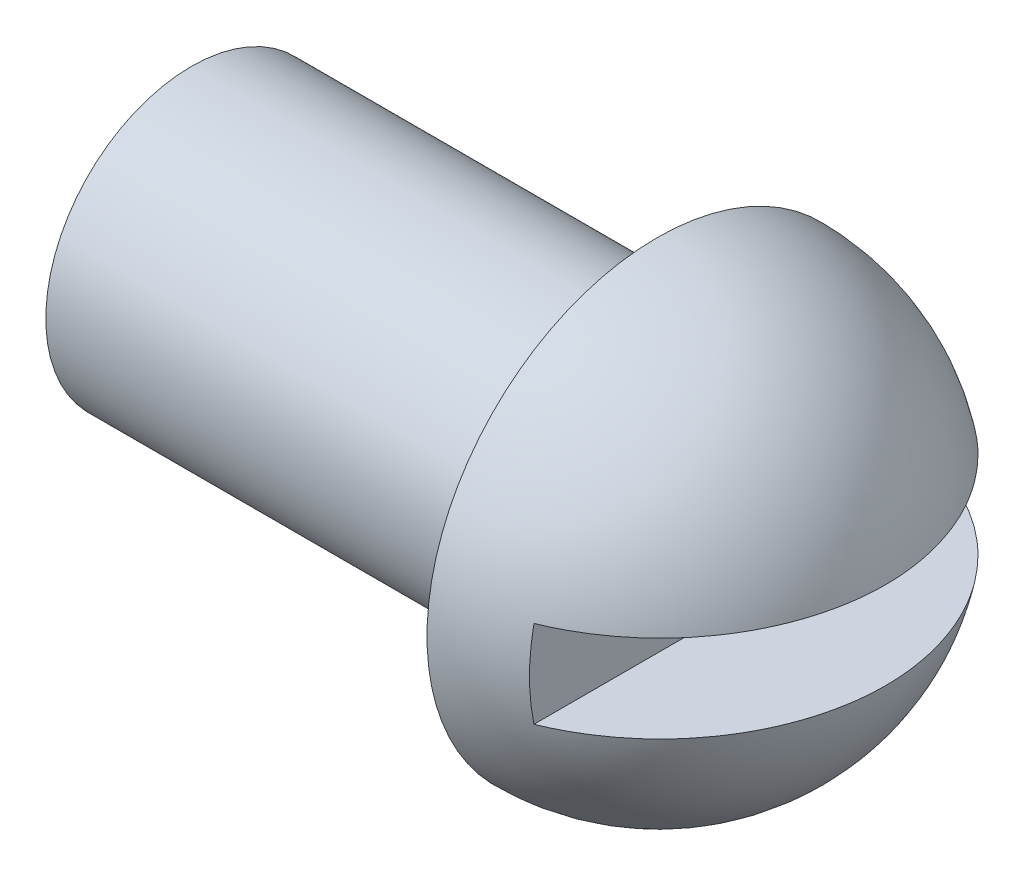
ISO-10303-21;
HEADER;
FILE_DESCRIPTION(('STEP AP214'),'2;1');
FILE_NAME('part.step','',(''),(''),'','','');
FILE_SCHEMA(('AUTOMOTIVE_DESIGN { 1 0 10303 214 1 1 1 1 }'));
ENDSEC;
DATA;
#1=APPLICATION_CONTEXT('core data for automotive mechanical design processes');
#2=APPLICATION_PROTOCOL_DEFINITION('international standard','automotive_design',2000,#1);
#3=PRODUCT_CONTEXT('',#1,'mechanical');
#4=PRODUCT('Part','Part','',(#3));
#5=PRODUCT_RELATED_PRODUCT_CATEGORY('part','',(#4));
#6=PRODUCT_DEFINITION_FORMATION('','',#4);
#7=PRODUCT_DEFINITION_CONTEXT('part definition',#1,'design');
#8=PRODUCT_DEFINITION('design','',#6,#7);
#9=PRODUCT_DEFINITION_SHAPE('','',#8);
#10=(LENGTH_UNIT() NAMED_UNIT(*) SI_UNIT(.MILLI.,.METRE.));
#11=(NAMED_UNIT(*) PLANE_ANGLE_UNIT() SI_UNIT($,.RADIAN.));
#12=(NAMED_UNIT(*) SI_UNIT($,.STERADIAN.) SOLID_ANGLE_UNIT());
#13=UNCERTAINTY_MEASURE_WITH_UNIT(LENGTH_MEASURE(1.E-05),#10,'distance_accuracy_value','');
#14=(GEOMETRIC_REPRESENTATION_CONTEXT(3) GLOBAL_UNCERTAINTY_ASSIGNED_CONTEXT((#13)) GLOBAL_UNIT_ASSIGNED_CONTEXT((#10,
#11,#12)) REPRESENTATION_CONTEXT('',''));
#15=CARTESIAN_POINT('',(0.,0.,0.));
#16=DIRECTION('',(0.,0.,1.));
#17=DIRECTION('',(1.,0.,0.));
#18=AXIS2_PLACEMENT_3D('',#15,#16,#17);
#19=CARTESIAN_POINT('',(8.00026825198543,0.,0.));
#20=DIRECTION('',(1.,0.,0.));
#21=DIRECTION('',(0.,1.,0.));
#22=AXIS2_PLACEMENT_3D('',#19,#20,#21);
#23=DEGENERATE_TOROIDAL_SURFACE('',#22,0.0463243340406743,4.,.F.);
#24=CARTESIAN_POINT('',(8.,0.,0.));
#25=DIRECTION('',(1.,0.,0.));
#26=DIRECTION('',(0.,1.,0.));
#27=AXIS2_PLACEMENT_3D('',#24,#25,#26);
#28=CIRCLE('',#27,3.95367565696443);
#29=CARTESIAN_POINT('',(8.,3.95367565696443,0.));
#30=VERTEX_POINT('',#29);
#31=EDGE_CURVE('E74',#30,#30,#28,.T.);
#32=ORIENTED_EDGE('',*,*,#31,.T.);
#33=EDGE_LOOP('',(#32));
#34=FACE_BOUND('',#33,.T.);
#35=CARTESIAN_POINT('',(9.47674223525347,0.,0.));
#36=DIRECTION('',(1.,0.,0.));
#37=DIRECTION('',(0.,0.,-1.));
#38=AXIS2_PLACEMENT_3D('',#35,#36,#37);
#39=CIRCLE('',#38,3.67120503056865);
#40=CARTESIAN_POINT('',(9.47674223525431,0.749999999999999,-3.59377884356705));
#41=VERTEX_POINT('',#40);
#42=CARTESIAN_POINT('',(9.47674223525347,-0.75,-3.59377884356739));
#43=VERTEX_POINT('',#42);
#44=EDGE_CURVE('E73',#41,#43,#39,.F.);
#45=ORIENTED_EDGE('',*,*,#44,.T.);
#46=CARTESIAN_POINT('',(11.9202003374959,-0.75,0.));
#47=CARTESIAN_POINT('',(11.9201983994545,-0.75,0.127127892702791));
#48=CARTESIAN_POINT('',(11.9136017850162,-0.75,0.25426763368415));
#49=CARTESIAN_POINT('',(11.8875672242592,-0.75,0.507204135226777));
#50=CARTESIAN_POINT('',(11.8681263815625,-0.75,0.633000586372549));
#51=CARTESIAN_POINT('',(11.7985356922681,-0.75,0.971161320447171));
#52=CARTESIAN_POINT('',(11.7363693929818,-0.75,1.18117005979859));
#53=CARTESIAN_POINT('',(11.5778080276327,-0.75,1.58803630106983));
#54=CARTESIAN_POINT('',(11.4813671827965,-0.75,1.78487579363653));
#55=CARTESIAN_POINT('',(11.2567803405267,-0.75,2.16023989618538));
#56=CARTESIAN_POINT('',(11.1285571102031,-0.75,2.33871837036127));
#57=CARTESIAN_POINT('',(10.8442072299621,-0.75,2.67174794075004));
#58=CARTESIAN_POINT('',(10.6880891472053,-0.75,2.82630635625025));
#59=CARTESIAN_POINT('',(10.3510433769533,-0.75,3.10831388054686));
#60=CARTESIAN_POINT('',(10.1699402719667,-0.75,3.23555342621007));
#61=CARTESIAN_POINT('',(9.78894524269814,-0.75,3.45786529880582));
#62=CARTESIAN_POINT('',(9.58905168229032,-0.75,3.55293482130321));
#63=CARTESIAN_POINT('',(9.17595803813495,-0.75,3.70827802374735));
#64=CARTESIAN_POINT('',(8.96274568649784,-0.750000000000001,3.7685190836508));
#65=CARTESIAN_POINT('',(8.52923824378311,-0.750000000000001,3.85235872814663));
#66=CARTESIAN_POINT('',(8.30894325839941,-0.750000000000001,3.87595785928659));
#67=CARTESIAN_POINT('',(7.86746674578217,-0.750000000000001,3.88584810737963));
#68=CARTESIAN_POINT('',(7.64628502744855,-0.750000000000001,3.87213069692039));
#69=CARTESIAN_POINT('',(7.20936013709108,-0.750000000000001,3.80775782120741));
#70=CARTESIAN_POINT('',(6.9936170522794,-0.750000000000001,3.75710176400679));
#71=CARTESIAN_POINT('',(6.57369160702321,-0.750000000000001,3.62028516736773));
#72=CARTESIAN_POINT('',(6.36950959234427,-0.750000000000001,3.53412356667573));
#73=CARTESIAN_POINT('',(5.97852028364105,-0.750000000000001,3.32874174277186));
#74=CARTESIAN_POINT('',(5.79171227020746,-0.750000000000001,3.20952288918395));
#75=CARTESIAN_POINT('',(5.44080513721123,-0.750000000000001,2.94143258827186));
#76=CARTESIAN_POINT('',(5.27670172977643,-0.750000000000001,2.7925667529103));
#77=CARTESIAN_POINT('',(4.9758180074134,-0.750000000000001,2.46935836037536));
#78=CARTESIAN_POINT('',(4.83904017842489,-0.750000000000001,2.29501348774701));
#79=CARTESIAN_POINT('',(4.59684151572186,-0.750000000000001,1.92596608344948));
#80=CARTESIAN_POINT('',(4.49139880048153,-0.750000000000001,1.73127788667839));
#81=CARTESIAN_POINT('',(4.31479771719154,-0.750000000000001,1.32678376161403));
#82=CARTESIAN_POINT('',(4.24363927679717,-0.750000000000001,1.11697786522234));
#83=CARTESIAN_POINT('',(4.16457523493709,-0.750000000000001,0.796116066956657));
#84=CARTESIAN_POINT('',(4.14284419270499,-0.750000000000001,0.688294752806297));
#85=CARTESIAN_POINT('',(4.10876973972274,-0.750000000000001,0.471151622082783));
#86=CARTESIAN_POINT('',(4.09642559056593,-0.750000000000001,0.361829924224076));
#87=CARTESIAN_POINT('',(4.0814668706302,-0.750000000000001,0.142567647465167));
#88=CARTESIAN_POINT('',(4.07884846277728,-0.750000000000001,0.0326273297763726));
#89=CARTESIAN_POINT('',(4.08343851326012,-0.750000000000001,-0.187047534348149));
#90=CARTESIAN_POINT('',(4.09064701526771,-0.750000000000001,-0.296782079867231));
#91=CARTESIAN_POINT('',(4.11415935723242,-0.750000000000001,-0.510899138299358));
#92=CARTESIAN_POINT('',(4.13009422034468,-0.750000000000001,-0.615322367650031));
#93=CARTESIAN_POINT('',(4.17049805257703,-0.750000000000001,-0.822475869521568));
#94=CARTESIAN_POINT('',(4.19496701755649,-0.750000000000001,-0.925206142863809));
#95=CARTESIAN_POINT('',(4.28085182462778,-0.750000000000001,-1.22994613432354));
#96=CARTESIAN_POINT('',(4.35475463729567,-0.750000000000001,-1.42858530186269));
#97=CARTESIAN_POINT('',(4.53611819478966,-0.750000000000001,-1.81666833758857));
#98=CARTESIAN_POINT('',(4.6444681814753,-0.750000000000001,-2.0056937666112));
#99=CARTESIAN_POINT('',(4.8909188913022,-0.750000000000001,-2.36321081335409));
#100=CARTESIAN_POINT('',(5.02901443179589,-0.750000000000001,-2.53170600011658));
#101=CARTESIAN_POINT('',(5.33341110024838,-0.750000000000001,-2.84589915679409));
#102=CARTESIAN_POINT('',(5.50010311711457,-0.750000000000001,-2.99121855664418));
#103=CARTESIAN_POINT('',(5.85550444070802,-0.750000000000001,-3.25188159950316));
#104=CARTESIAN_POINT('',(6.04421661801092,-0.750000000000001,-3.367221327985));
#105=CARTESIAN_POINT('',(6.43861615363401,-0.750000000000001,-3.56480313722736));
#106=CARTESIAN_POINT('',(6.64433005770018,-0.750000000000001,-3.64699223514433));
#107=CARTESIAN_POINT('',(7.06662595095388,-0.750000000000001,-3.77567798599259));
#108=CARTESIAN_POINT('',(7.2832075807208,-0.750000000000001,-3.82217581848812));
#109=CARTESIAN_POINT('',(7.72118278411997,-0.750000000000001,-3.8781770856191));
#110=CARTESIAN_POINT('',(7.94257808643188,-0.750000000000001,-3.88766700176168));
#111=CARTESIAN_POINT('',(8.38382164140263,-0.750000000000001,-3.86934585872554));
#112=CARTESIAN_POINT('',(8.60366988106844,-0.750000000000001,-3.84153448664683));
#113=CARTESIAN_POINT('',(9.03558927139969,-0.750000000000001,-3.74939604999839));
#114=CARTESIAN_POINT('',(9.24765999563242,-0.75,-3.68506698638051));
#115=CARTESIAN_POINT('',(9.65799407472349,-0.75,-3.52171398933563));
#116=CARTESIAN_POINT('',(9.85625717113848,-0.75,-3.42268940670671));
#117=CARTESIAN_POINT('',(10.2333306760487,-0.75,-3.1927572592611));
#118=CARTESIAN_POINT('',(10.41214199094,-0.75,-3.06185118095009));
#119=CARTESIAN_POINT('',(10.7452167276916,-0.75,-2.77188379177952));
#120=CARTESIAN_POINT('',(10.8994830790804,-0.75,-2.61282584573915));
#121=CARTESIAN_POINT('',(11.1790042064915,-0.75,-2.27115021293892));
#122=CARTESIAN_POINT('',(11.3042779319617,-0.75,-2.08854803681552));
#123=CARTESIAN_POINT('',(11.5223920334036,-0.75,-1.70479648457158));
#124=CARTESIAN_POINT('',(11.615213649553,-0.75,-1.50363646521804));
#125=CARTESIAN_POINT('',(11.7655286749809,-0.75,-1.08847525088461));
#126=CARTESIAN_POINT('',(11.8230380945396,-0.75,-0.874479923715605));
#127=CARTESIAN_POINT('',(11.8810528972685,-0.75,-0.548870404185941));
#128=CARTESIAN_POINT('',(11.8956827338653,-0.75,-0.439608856664222));
#129=CARTESIAN_POINT('',(11.915255387846,-0.75,-0.220234268126238));
#130=CARTESIAN_POINT('',(11.9202020162792,-0.75,-0.110121579233648));
#131=CARTESIAN_POINT('',(11.9202003374959,-0.75,0.));
#132=B_SPLINE_CURVE_WITH_KNOTS('',3,(#46,#47,#48,#49,#50,#51,#52,#53,#54,#55,#56,#57,#58,#59,
#60,#61,#62,#63,#64,#65,#66,#67,#68,#69,#70,#71,#72,#73,#74,#75,#76,#77,#78,#79,#80,#81,#82,#83,
#84,#85,#86,#87,#88,#89,#90,#91,#92,#93,#94,#95,#96,#97,#98,#99,#100,#101,#102,#103,#104,#105,
#106,#107,#108,#109,#110,#111,#112,#113,#114,#115,#116,#117,#118,#119,#120,#121,#122,#123,#124,
#125,#126,#127,#128,#129,#130,#131),.UNSPECIFIED.,.T.,.F.,(4,2,2,2,2,2,2,2,2,2,2,2,2,2,2,2,2,2,
2,2,2,2,2,2,2,2,2,2,2,2,2,2,2,2,2,2,2,2,2,2,2,2,4),(0.,0.38122654245514,0.762539080985425,
1.4162498368959,2.07083702297519,2.72703075932458,3.38302330857938,4.04388115053535,
4.70479658821571,5.36633003509043,6.02785361449928,6.68952837507098,7.3512137393045,
8.01291888261518,8.67459661433654,9.33614921401973,9.99776197095606,10.658911627616,
11.3200598891497,11.6496952577712,11.9793046934095,12.3087840751867,12.6382649212103,
12.9547836458202,13.2713022168592,13.9040998804663,14.5547785866135,15.2053440148367,
15.8656375598929,16.5260172780077,17.1874483021628,17.848857465676,18.5105082104206,
19.1721645054241,19.8338570242497,20.4955619249336,21.1572359788889,21.8188310003654,
22.479992377415,23.141535327228,23.8027781166181,24.1331367856303,24.4633654082276),.UNSPECIFIED.);
#133=CARTESIAN_POINT('',(9.47674223525347,-0.75,3.59377884356739));
#134=VERTEX_POINT('',#133);
#135=EDGE_CURVE('E11',#43,#134,#132,.T.);
#136=ORIENTED_EDGE('',*,*,#135,.T.);
#137=CARTESIAN_POINT('',(9.47674223525347,0.749999999999999,3.59377884356739));
#138=VERTEX_POINT('',#137);
#139=EDGE_CURVE('E50',#134,#138,#39,.F.);
#140=ORIENTED_EDGE('',*,*,#139,.T.);
#141=CARTESIAN_POINT('',(11.9202003374959,0.75,0.));
#142=CARTESIAN_POINT('',(11.9201983994545,0.75,0.127127892702791));
#143=CARTESIAN_POINT('',(11.9136017850162,0.75,0.25426763368415));
#144=CARTESIAN_POINT('',(11.8875672242592,0.75,0.507204135226777));
#145=CARTESIAN_POINT('',(11.8681263815625,0.75,0.633000586372549));
#146=CARTESIAN_POINT('',(11.7985356922681,0.75,0.971161320447171));
#147=CARTESIAN_POINT('',(11.7363693929818,0.75,1.18117005979859));
#148=CARTESIAN_POINT('',(11.5778080276327,0.75,1.58803630106983));
#149=CARTESIAN_POINT('',(11.4813671827965,0.75,1.78487579363653));
#150=CARTESIAN_POINT('',(11.2567803405267,0.75,2.16023989618538));
#151=CARTESIAN_POINT('',(11.1285571102031,0.75,2.33871837036127));
#152=CARTESIAN_POINT('',(10.8442072299621,0.75,2.67174794075004));
#153=CARTESIAN_POINT('',(10.6880891472053,0.75,2.82630635625025));
#154=CARTESIAN_POINT('',(10.3510433769533,0.75,3.10831388054686));
#155=CARTESIAN_POINT('',(10.1699402719667,0.749999999999999,3.23555342621007));
#156=CARTESIAN_POINT('',(9.78894524269814,0.749999999999999,3.45786529880582));
#157=CARTESIAN_POINT('',(9.58905168229032,0.749999999999999,3.55293482130321));
#158=CARTESIAN_POINT('',(9.17595803813495,0.749999999999999,3.70827802374735));
#159=CARTESIAN_POINT('',(8.96274568649784,0.749999999999999,3.7685190836508));
#160=CARTESIAN_POINT('',(8.52923824378311,0.749999999999999,3.85235872814663));
#161=CARTESIAN_POINT('',(8.30894325839941,0.749999999999999,3.87595785928659));
#162=CARTESIAN_POINT('',(7.86746674578217,0.749999999999999,3.88584810737963));
#163=CARTESIAN_POINT('',(7.64628502744855,0.749999999999999,3.87213069692039));
#164=CARTESIAN_POINT('',(7.20936013709108,0.749999999999999,3.80775782120741));
#165=CARTESIAN_POINT('',(6.9936170522794,0.749999999999999,3.75710176400679));
#166=CARTESIAN_POINT('',(6.57369160702321,0.749999999999999,3.62028516736773));
#167=CARTESIAN_POINT('',(6.36950959234426,0.749999999999999,3.53412356667573));
#168=CARTESIAN_POINT('',(5.97852028364105,0.749999999999999,3.32874174277186));
#169=CARTESIAN_POINT('',(5.79171227020746,0.749999999999999,3.20952288918395));
#170=CARTESIAN_POINT('',(5.44080513721123,0.749999999999999,2.94143258827186));
#171=CARTESIAN_POINT('',(5.27670172977643,0.749999999999998,2.7925667529103));
#172=CARTESIAN_POINT('',(4.9758180074134,0.749999999999998,2.46935836037536));
#173=CARTESIAN_POINT('',(4.83904017842489,0.749999999999998,2.29501348774701));
#174=CARTESIAN_POINT('',(4.59684151572186,0.749999999999998,1.92596608344948));
#175=CARTESIAN_POINT('',(4.49139880048153,0.749999999999998,1.73127788667839));
#176=CARTESIAN_POINT('',(4.31479771719154,0.749999999999998,1.32678376161403));
#177=CARTESIAN_POINT('',(4.24363927679717,0.749999999999998,1.11697786522234));
#178=CARTESIAN_POINT('',(4.16457523493709,0.749999999999998,0.796116066956658));
#179=CARTESIAN_POINT('',(4.14284419270499,0.749999999999998,0.688294752806297));
#180=CARTESIAN_POINT('',(4.10876973972274,0.749999999999998,0.471151622082784));
#181=CARTESIAN_POINT('',(4.09642559056593,0.749999999999998,0.361829924224077));
#182=CARTESIAN_POINT('',(4.0814668706302,0.749999999999998,0.142567647465168));
#183=CARTESIAN_POINT('',(4.07884846277728,0.749999999999998,0.0326273297763734));
#184=CARTESIAN_POINT('',(4.08343851326012,0.749999999999998,-0.187047534348148));
#185=CARTESIAN_POINT('',(4.09064701526771,0.749999999999998,-0.296782079867231));
#186=CARTESIAN_POINT('',(4.11415935723242,0.749999999999998,-0.510899138299357));
#187=CARTESIAN_POINT('',(4.13009422034467,0.749999999999998,-0.61532236765003));
#188=CARTESIAN_POINT('',(4.17049805257703,0.749999999999998,-0.822475869521567));
#189=CARTESIAN_POINT('',(4.19496701755649,0.749999999999998,-0.925206142863809));
#190=CARTESIAN_POINT('',(4.28085182462778,0.749999999999998,-1.22994613432354));
#191=CARTESIAN_POINT('',(4.35475463729567,0.749999999999998,-1.42858530186269));
#192=CARTESIAN_POINT('',(4.53611819478965,0.749999999999998,-1.81666833758857));
#193=CARTESIAN_POINT('',(4.6444681814753,0.749999999999998,-2.0056937666112));
#194=CARTESIAN_POINT('',(4.8909188913022,0.749999999999998,-2.36321081335409));
#195=CARTESIAN_POINT('',(5.02901443179589,0.749999999999998,-2.53170600011658));
#196=CARTESIAN_POINT('',(5.33341110024838,0.749999999999998,-2.84589915679409));
#197=CARTESIAN_POINT('',(5.50010311711457,0.749999999999999,-2.99121855664418));
#198=CARTESIAN_POINT('',(5.85550444070802,0.749999999999999,-3.25188159950316));
#199=CARTESIAN_POINT('',(6.04421661801092,0.749999999999999,-3.367221327985));
#200=CARTESIAN_POINT('',(6.43861615363401,0.749999999999999,-3.56480313722736));
#201=CARTESIAN_POINT('',(6.64433005770018,0.749999999999999,-3.64699223514433));
#202=CARTESIAN_POINT('',(7.06662595095388,0.749999999999999,-3.77567798599259));
#203=CARTESIAN_POINT('',(7.2832075807208,0.749999999999999,-3.82217581848812));
#204=CARTESIAN_POINT('',(7.72118278411996,0.749999999999999,-3.8781770856191));
#205=CARTESIAN_POINT('',(7.94257808643188,0.749999999999999,-3.88766700176168));
#206=CARTESIAN_POINT('',(8.38382164140263,0.749999999999999,-3.86934585872554));
#207=CARTESIAN_POINT('',(8.60366988106844,0.749999999999999,-3.84153448664683));
#208=CARTESIAN_POINT('',(9.03558927139969,0.749999999999999,-3.74939604999839));
#209=CARTESIAN_POINT('',(9.24765999563242,0.749999999999999,-3.68506698638051));
#210=CARTESIAN_POINT('',(9.65799407472349,0.749999999999999,-3.52171398933563));
#211=CARTESIAN_POINT('',(9.85625717113848,0.749999999999999,-3.42268940670671));
#212=CARTESIAN_POINT('',(10.2333306760487,0.749999999999999,-3.1927572592611));
#213=CARTESIAN_POINT('',(10.41214199094,0.75,-3.06185118095009));
#214=CARTESIAN_POINT('',(10.7452167276916,0.75,-2.77188379177952));
#215=CARTESIAN_POINT('',(10.8994830790804,0.75,-2.61282584573915));
#216=CARTESIAN_POINT('',(11.1790042064915,0.75,-2.27115021293892));
#217=CARTESIAN_POINT('',(11.3042779319617,0.75,-2.08854803681552));
#218=CARTESIAN_POINT('',(11.5223920334036,0.75,-1.70479648457158));
#219=CARTESIAN_POINT('',(11.615213649553,0.75,-1.50363646521804));
#220=CARTESIAN_POINT('',(11.7655286749809,0.75,-1.08847525088461));
#221=CARTESIAN_POINT('',(11.8230380945396,0.75,-0.874479923715604));
#222=CARTESIAN_POINT('',(11.8810528972685,0.75,-0.548870404185941));
#223=CARTESIAN_POINT('',(11.8956827338653,0.75,-0.439608856664222));
#224=CARTESIAN_POINT('',(11.915255387846,0.75,-0.220234268126238));
#225=CARTESIAN_POINT('',(11.9202020162792,0.75,-0.110121579233648));
#226=CARTESIAN_POINT('',(11.9202003374959,0.75,0.));
#227=B_SPLINE_CURVE_WITH_KNOTS('',3,(#141,#142,#143,#144,#145,#146,#147,#148,#149,#150,#151,
#152,#153,#154,#155,#156,#157,#158,#159,#160,#161,#162,#163,#164,#165,#166,#167,#168,#169,#170,
#171,#172,#173,#174,#175,#176,#177,#178,#179,#180,#181,#182,#183,#184,#185,#186,#187,#188,#189,
#190,#191,#192,#193,#194,#195,#196,#197,#198,#199,#200,#201,#202,#203,#204,#205,#206,#207,#208,
#209,#210,#211,#212,#213,#214,#215,#216,#217,#218,#219,#220,#221,#222,#223,#224,#225,#226),
.UNSPECIFIED.,.T.,.F.,(4,2,2,2,2,2,2,2,2,2,2,2,2,2,2,2,2,2,2,2,2,2,2,2,2,2,2,2,2,2,2,2,2,2,2,2,
2,2,2,2,2,2,4),(0.,0.38122654245514,0.762539080985425,1.4162498368959,2.07083702297518,
2.72703075932458,3.38302330857938,4.04388115053535,4.70479658821571,5.36633003509043,
6.02785361449928,6.68952837507098,7.3512137393045,8.01291888261518,8.67459661433654,
9.33614921401973,9.99776197095606,10.658911627616,11.3200598891497,11.6496952577712,
11.9793046934095,12.3087840751867,12.6382649212103,12.9547836458202,13.2713022168592,
13.9040998804663,14.5547785866135,15.2053440148367,15.8656375598929,16.5260172780077,
17.1874483021628,17.848857465676,18.5105082104206,19.1721645054241,19.8338570242497,
20.4955619249336,21.1572359788889,21.8188310003654,22.479992377415,23.141535327228,
23.8027781166181,24.1331367856303,24.4633654082276),.UNSPECIFIED.);
#228=EDGE_CURVE('E69',#41,#138,#227,.T.);
#229=ORIENTED_EDGE('',*,*,#228,.F.);
#230=EDGE_LOOP('',(#45,#136,#140,#229));
#231=FACE_BOUND('',#230,.T.);
#232=ADVANCED_FACE('F38',(#34,#231),#23,.F.);
#233=CARTESIAN_POINT('',(8.,3.95367565696443,0.));
#234=DIRECTION('',(-1.,0.,0.));
#235=DIRECTION('',(0.,-1.,0.));
#236=AXIS2_PLACEMENT_3D('',#233,#234,#235);
#237=PLANE('',#236);
#238=CARTESIAN_POINT('',(8.,0.,0.));
#239=DIRECTION('',(1.,0.,0.));
#240=DIRECTION('',(0.,1.,0.));
#241=AXIS2_PLACEMENT_3D('',#238,#239,#240);
#242=CIRCLE('',#241,2.5);
#243=CARTESIAN_POINT('',(8.,2.5,0.));
#244=VERTEX_POINT('',#243);
#245=EDGE_CURVE('E107',#244,#244,#242,.T.);
#246=ORIENTED_EDGE('',*,*,#245,.T.);
#247=EDGE_LOOP('',(#246));
#248=FACE_BOUND('',#247,.T.);
#249=ORIENTED_EDGE('',*,*,#31,.F.);
#250=EDGE_LOOP('',(#249));
#251=FACE_BOUND('',#250,.T.);
#252=ADVANCED_FACE('F96',(#248,#251),#237,.T.);
#253=CARTESIAN_POINT('',(12.,0.,0.));
#254=DIRECTION('',(1.,0.,0.));
#255=DIRECTION('',(0.,1.,0.));
#256=AXIS2_PLACEMENT_3D('',#253,#254,#255);
#257=CYLINDRICAL_SURFACE('',#256,2.5);
#258=CARTESIAN_POINT('',(0.,0.,0.));
#259=DIRECTION('',(1.,0.,0.));
#260=DIRECTION('',(0.,1.,0.));
#261=AXIS2_PLACEMENT_3D('',#258,#259,#260);
#262=CIRCLE('',#261,2.5);
#263=CARTESIAN_POINT('',(0.,2.5,0.));
#264=VERTEX_POINT('',#263);
#265=EDGE_CURVE('E110',#264,#264,#262,.T.);
#266=ORIENTED_EDGE('',*,*,#265,.T.);
#267=EDGE_LOOP('',(#266));
#268=FACE_BOUND('',#267,.T.);
#269=ORIENTED_EDGE('',*,*,#245,.F.);
#270=EDGE_LOOP('',(#269));
#271=FACE_BOUND('',#270,.T.);
#272=ADVANCED_FACE('F93',(#268,#271),#257,.T.);
#273=CARTESIAN_POINT('',(0.,0.,0.));
#274=DIRECTION('',(-1.,0.,0.));
#275=DIRECTION('',(0.,-1.,0.));
#276=AXIS2_PLACEMENT_3D('',#273,#274,#275);
#277=PLANE('',#276);
#278=ORIENTED_EDGE('',*,*,#265,.F.);
#279=EDGE_LOOP('',(#278));
#280=FACE_BOUND('',#279,.T.);
#281=ADVANCED_FACE('F89',(#280),#277,.T.);
#282=CARTESIAN_POINT('',(12.6471238849651,-0.75,-3.95367565696443));
#283=DIRECTION('',(0.,1.,0.));
#284=DIRECTION('',(-1.,0.,0.));
#285=AXIS2_PLACEMENT_3D('',#282,#283,#284);
#286=PLANE('',#285);
#287=DIRECTION('',(0.,0.,1.));
#288=VECTOR('',#287,1.);
#289=CARTESIAN_POINT('',(9.47674223525347,-0.75,-3.95367565696443));
#290=LINE('',#289,#288);
#291=EDGE_CURVE('E77',#43,#134,#290,.T.);
#292=ORIENTED_EDGE('',*,*,#291,.T.);
#293=ORIENTED_EDGE('',*,*,#135,.F.);
#294=EDGE_LOOP('',(#292,#293));
#295=FACE_BOUND('',#294,.T.);
#296=ADVANCED_FACE('F92',(#295),#286,.T.);
#297=CARTESIAN_POINT('',(9.47674223525347,-0.75,-3.95367565696443));
#298=DIRECTION('',(1.,0.,0.));
#299=DIRECTION('',(0.,0.,-1.));
#300=AXIS2_PLACEMENT_3D('',#297,#298,#299);
#301=PLANE('',#300);
#302=ORIENTED_EDGE('',*,*,#291,.F.);
#303=ORIENTED_EDGE('',*,*,#44,.F.);
#304=DIRECTION('',(0.,0.,1.));
#305=VECTOR('',#304,1.);
#306=CARTESIAN_POINT('',(9.47674223525347,0.749999999999999,-3.95367565696443));
#307=LINE('',#306,#305);
#308=EDGE_CURVE('E56',#41,#138,#307,.T.);
#309=ORIENTED_EDGE('',*,*,#308,.T.);
#310=ORIENTED_EDGE('',*,*,#139,.F.);
#311=EDGE_LOOP('',(#302,#303,#309,#310));
#312=FACE_BOUND('',#311,.T.);
#313=ADVANCED_FACE('F76',(#312),#301,.T.);
#314=CARTESIAN_POINT('',(12.6471238849651,0.75,-3.95367565696443));
#315=DIRECTION('',(0.,1.,0.));
#316=DIRECTION('',(-1.,0.,0.));
#317=AXIS2_PLACEMENT_3D('',#314,#315,#316);
#318=PLANE('',#317);
#319=ORIENTED_EDGE('',*,*,#228,.T.);
#320=ORIENTED_EDGE('',*,*,#308,.F.);
#321=EDGE_LOOP('',(#319,#320));
#322=FACE_BOUND('',#321,.T.);
#323=ADVANCED_FACE('F70',(#322),#318,.F.);
#324=CLOSED_SHELL('',(#232,#252,#272,#281,#296,#313,#323));
#325=MANIFOLD_SOLID_BREP('B2',#324);
#326=ADVANCED_BREP_SHAPE_REPRESENTATION('',(#18,#325),#14);
#327=SHAPE_DEFINITION_REPRESENTATION(#9,#326);
ENDSEC;
END-ISO-10303-21;
